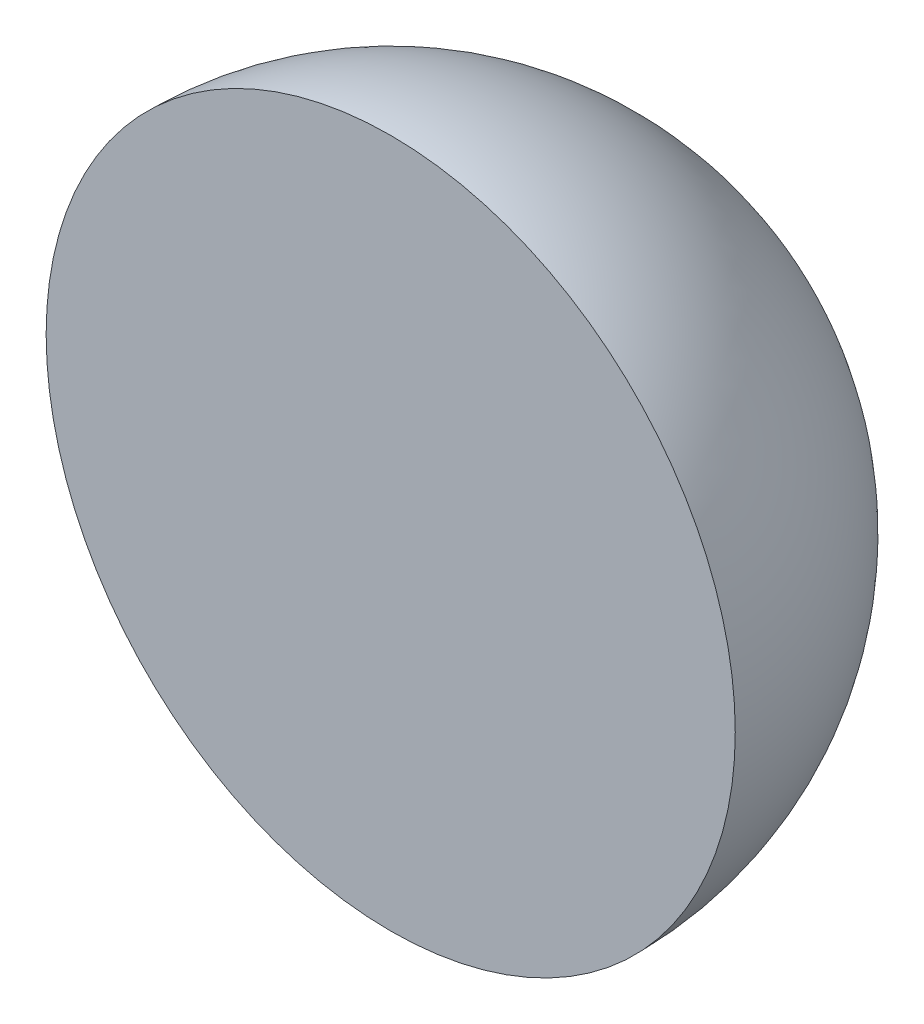
ISO-10303-21;
HEADER;
FILE_DESCRIPTION(('STEP AP214'),'2;1');
FILE_NAME('part.step','',(''),(''),'','','');
FILE_SCHEMA(('AUTOMOTIVE_DESIGN { 1 0 10303 214 1 1 1 1 }'));
ENDSEC;
DATA;
#1=APPLICATION_CONTEXT('core data for automotive mechanical design processes');
#2=APPLICATION_PROTOCOL_DEFINITION('international standard','automotive_design',2000,#1);
#3=PRODUCT_CONTEXT('',#1,'mechanical');
#4=PRODUCT('Part','Part','',(#3));
#5=PRODUCT_RELATED_PRODUCT_CATEGORY('part','',(#4));
#6=PRODUCT_DEFINITION_FORMATION('','',#4);
#7=PRODUCT_DEFINITION_CONTEXT('part definition',#1,'design');
#8=PRODUCT_DEFINITION('design','',#6,#7);
#9=PRODUCT_DEFINITION_SHAPE('','',#8);
#10=(LENGTH_UNIT() NAMED_UNIT(*) SI_UNIT(.MILLI.,.METRE.));
#11=(NAMED_UNIT(*) PLANE_ANGLE_UNIT() SI_UNIT($,.RADIAN.));
#12=(NAMED_UNIT(*) SI_UNIT($,.STERADIAN.) SOLID_ANGLE_UNIT());
#13=UNCERTAINTY_MEASURE_WITH_UNIT(LENGTH_MEASURE(1.E-05),#10,'distance_accuracy_value','');
#14=(GEOMETRIC_REPRESENTATION_CONTEXT(3) GLOBAL_UNCERTAINTY_ASSIGNED_CONTEXT((#13)) GLOBAL_UNIT_ASSIGNED_CONTEXT((#10,
#11,#12)) REPRESENTATION_CONTEXT('',''));
#15=CARTESIAN_POINT('',(0.,0.,0.));
#16=DIRECTION('',(0.,0.,1.));
#17=DIRECTION('',(1.,0.,0.));
#18=AXIS2_PLACEMENT_3D('',#15,#16,#17);
#19=CARTESIAN_POINT('',(0.,0.,0.));
#20=DIRECTION('',(0.,0.,-1.));
#21=DIRECTION('',(-1.,0.,0.));
#22=AXIS2_PLACEMENT_3D('',#19,#20,#21);
#23=PLANE('',#22);
#24=CARTESIAN_POINT('',(0.,0.,0.));
#25=DIRECTION('',(0.,0.,-1.));
#26=DIRECTION('',(-1.,0.,0.));
#27=AXIS2_PLACEMENT_3D('',#24,#25,#26);
#28=CIRCLE('',#27,197.887626784113);
#29=CARTESIAN_POINT('',(-197.887626784113,0.,0.));
#30=VERTEX_POINT('',#29);
#31=EDGE_CURVE('E10',#30,#30,#28,.T.);
#32=ORIENTED_EDGE('',*,*,#31,.F.);
#33=EDGE_LOOP('',(#32));
#34=FACE_BOUND('',#33,.T.);
#35=ADVANCED_FACE('F31',(#34),#23,.F.);
#36=CARTESIAN_POINT('',(0.,0.,0.));
#37=DIRECTION('',(0.,0.,-1.));
#38=DIRECTION('',(1.,0.,0.));
#39=AXIS2_PLACEMENT_3D('',#36,#37,#38);
#40=SPHERICAL_SURFACE('',#39,197.887626784113);
#41=ORIENTED_EDGE('',*,*,#31,.T.);
#42=EDGE_LOOP('',(#41));
#43=FACE_BOUND('',#42,.T.);
#44=ADVANCED_FACE('F38',(#43),#40,.T.);
#45=CLOSED_SHELL('',(#35,#44));
#46=MANIFOLD_SOLID_BREP('B2',#45);
#47=ADVANCED_BREP_SHAPE_REPRESENTATION('',(#18,#46),#14);
#48=SHAPE_DEFINITION_REPRESENTATION(#9,#47);
ENDSEC;
END-ISO-10303-21;
